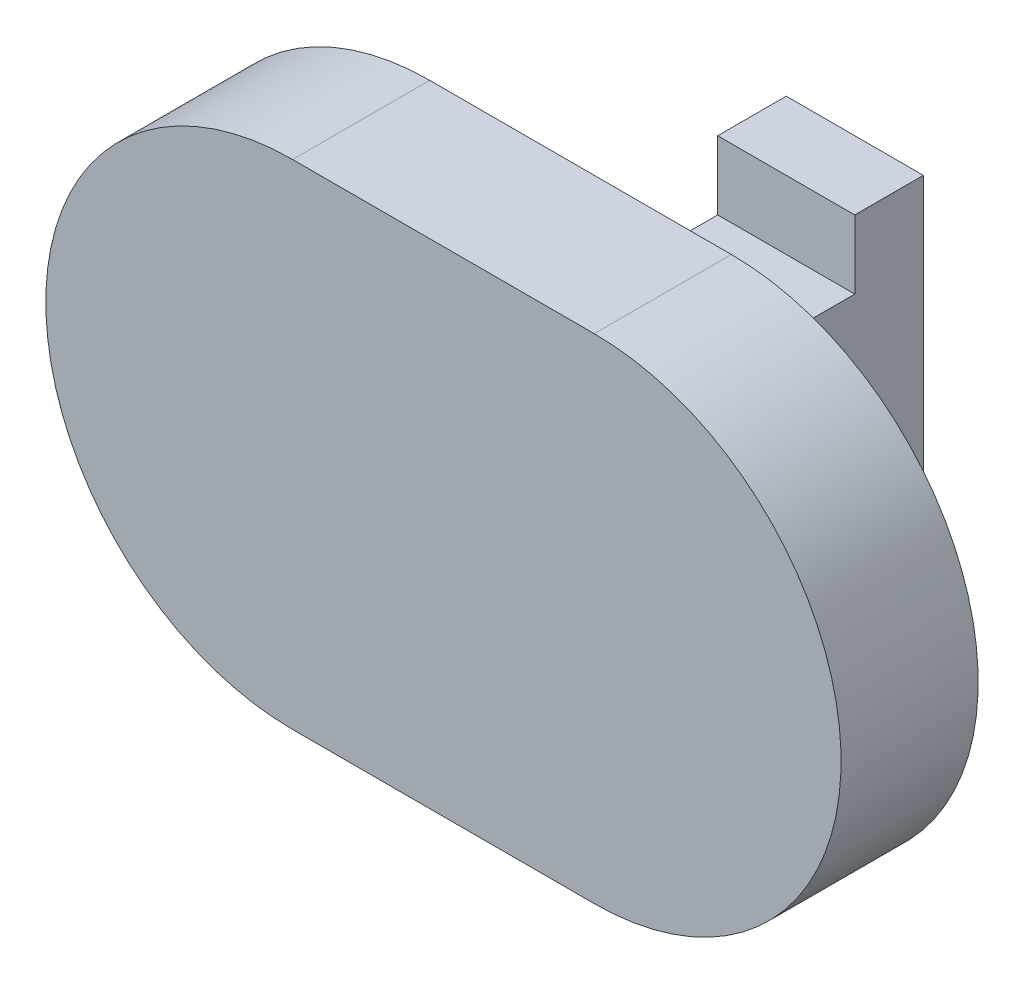
ISO-10303-21;
HEADER;
FILE_DESCRIPTION(('STEP AP214'),'2;1');
FILE_NAME('part.step','',(''),(''),'','','');
FILE_SCHEMA(('AUTOMOTIVE_DESIGN { 1 0 10303 214 1 1 1 1 }'));
ENDSEC;
DATA;
#1=APPLICATION_CONTEXT('core data for automotive mechanical design processes');
#2=APPLICATION_PROTOCOL_DEFINITION('international standard','automotive_design',2000,#1);
#3=PRODUCT_CONTEXT('',#1,'mechanical');
#4=PRODUCT('Part','Part','',(#3));
#5=PRODUCT_RELATED_PRODUCT_CATEGORY('part','',(#4));
#6=PRODUCT_DEFINITION_FORMATION('','',#4);
#7=PRODUCT_DEFINITION_CONTEXT('part definition',#1,'design');
#8=PRODUCT_DEFINITION('design','',#6,#7);
#9=PRODUCT_DEFINITION_SHAPE('','',#8);
#10=(LENGTH_UNIT() NAMED_UNIT(*) SI_UNIT(.MILLI.,.METRE.));
#11=(NAMED_UNIT(*) PLANE_ANGLE_UNIT() SI_UNIT($,.RADIAN.));
#12=(NAMED_UNIT(*) SI_UNIT($,.STERADIAN.) SOLID_ANGLE_UNIT());
#13=UNCERTAINTY_MEASURE_WITH_UNIT(LENGTH_MEASURE(1.E-05),#10,'distance_accuracy_value','');
#14=(GEOMETRIC_REPRESENTATION_CONTEXT(3) GLOBAL_UNCERTAINTY_ASSIGNED_CONTEXT((#13)) GLOBAL_UNIT_ASSIGNED_CONTEXT((#10,
#11,#12)) REPRESENTATION_CONTEXT('',''));
#15=CARTESIAN_POINT('',(0.,0.,0.));
#16=DIRECTION('',(0.,0.,1.));
#17=DIRECTION('',(1.,0.,0.));
#18=AXIS2_PLACEMENT_3D('',#15,#16,#17);
#19=CARTESIAN_POINT('',(-1.397,0.,-1.27));
#20=DIRECTION('',(0.,0.,1.));
#21=DIRECTION('',(1.,0.,0.));
#22=AXIS2_PLACEMENT_3D('',#19,#20,#21);
#23=PLANE('',#22);
#24=CARTESIAN_POINT('',(-1.397,0.,-1.27));
#25=DIRECTION('',(0.,0.,1.));
#26=DIRECTION('',(1.,0.,0.));
#27=AXIS2_PLACEMENT_3D('',#24,#25,#26);
#28=CIRCLE('',#27,2.286);
#29=CARTESIAN_POINT('',(-1.397,2.286,-1.27));
#30=VERTEX_POINT('',#29);
#31=CARTESIAN_POINT('',(-1.397,-2.286,-1.27));
#32=VERTEX_POINT('',#31);
#33=EDGE_CURVE('E189',#30,#32,#28,.T.);
#34=ORIENTED_EDGE('',*,*,#33,.F.);
#35=DIRECTION('',(-1.,0.,0.));
#36=VECTOR('',#35,1.);
#37=CARTESIAN_POINT('',(-1.397,2.286,-1.27));
#38=LINE('',#37,#36);
#39=CARTESIAN_POINT('',(1.397,2.286,-1.27));
#40=VERTEX_POINT('',#39);
#41=EDGE_CURVE('E199',#40,#30,#38,.T.);
#42=ORIENTED_EDGE('',*,*,#41,.F.);
#43=CARTESIAN_POINT('',(1.397,0.,-1.27));
#44=DIRECTION('',(0.,0.,1.));
#45=DIRECTION('',(1.,0.,0.));
#46=AXIS2_PLACEMENT_3D('',#43,#44,#45);
#47=CIRCLE('',#46,2.286);
#48=CARTESIAN_POINT('',(1.397,-2.286,-1.27));
#49=VERTEX_POINT('',#48);
#50=EDGE_CURVE('E196',#49,#40,#47,.T.);
#51=ORIENTED_EDGE('',*,*,#50,.F.);
#52=DIRECTION('',(1.,0.,0.));
#53=VECTOR('',#52,1.);
#54=CARTESIAN_POINT('',(-1.397,-2.286,-1.27));
#55=LINE('',#54,#53);
#56=EDGE_CURVE('E192',#32,#49,#55,.T.);
#57=ORIENTED_EDGE('',*,*,#56,.F.);
#58=EDGE_LOOP('',(#34,#42,#51,#57));
#59=FACE_BOUND('',#58,.T.);
#60=DIRECTION('',(0.,-1.,0.));
#61=VECTOR('',#60,1.);
#62=CARTESIAN_POINT('',(0.635,0.635,-1.27));
#63=LINE('',#62,#61);
#64=CARTESIAN_POINT('',(0.635,0.635,-1.27));
#65=VERTEX_POINT('',#64);
#66=CARTESIAN_POINT('',(0.635,-0.635,-1.27));
#67=VERTEX_POINT('',#66);
#68=EDGE_CURVE('E61',#65,#67,#63,.T.);
#69=ORIENTED_EDGE('',*,*,#68,.F.);
#70=DIRECTION('',(1.,0.,0.));
#71=VECTOR('',#70,1.);
#72=CARTESIAN_POINT('',(-0.635,0.635,-1.27));
#73=LINE('',#72,#71);
#74=CARTESIAN_POINT('',(-0.635,0.635,-1.27));
#75=VERTEX_POINT('',#74);
#76=EDGE_CURVE('E65',#75,#65,#73,.T.);
#77=ORIENTED_EDGE('',*,*,#76,.F.);
#78=DIRECTION('',(0.,1.,0.));
#79=VECTOR('',#78,1.);
#80=CARTESIAN_POINT('',(-0.635,0.635,-1.27));
#81=LINE('',#80,#79);
#82=CARTESIAN_POINT('',(-0.635,-0.635,-1.27));
#83=VERTEX_POINT('',#82);
#84=EDGE_CURVE('E174',#83,#75,#81,.T.);
#85=ORIENTED_EDGE('',*,*,#84,.F.);
#86=DIRECTION('',(-1.,0.,0.));
#87=VECTOR('',#86,1.);
#88=CARTESIAN_POINT('',(-0.635,-0.635,-1.27));
#89=LINE('',#88,#87);
#90=EDGE_CURVE('E159',#67,#83,#89,.T.);
#91=ORIENTED_EDGE('',*,*,#90,.F.);
#92=EDGE_LOOP('',(#69,#77,#85,#91));
#93=FACE_BOUND('',#92,.T.);
#94=ADVANCED_FACE('F44',(#59,#93),#23,.F.);
#95=CARTESIAN_POINT('',(-1.397,0.,-1.27));
#96=DIRECTION('',(0.,0.,1.));
#97=DIRECTION('',(1.,0.,0.));
#98=AXIS2_PLACEMENT_3D('',#95,#96,#97);
#99=CYLINDRICAL_SURFACE('',#98,2.286);
#100=CARTESIAN_POINT('',(-1.397,0.,0.));
#101=DIRECTION('',(0.,0.,1.));
#102=DIRECTION('',(1.,0.,0.));
#103=AXIS2_PLACEMENT_3D('',#100,#101,#102);
#104=CIRCLE('',#103,2.286);
#105=CARTESIAN_POINT('',(-1.397,2.286,0.));
#106=VERTEX_POINT('',#105);
#107=CARTESIAN_POINT('',(-1.397,-2.286,0.));
#108=VERTEX_POINT('',#107);
#109=EDGE_CURVE('E188',#106,#108,#104,.T.);
#110=ORIENTED_EDGE('',*,*,#109,.F.);
#111=DIRECTION('',(0.,0.,1.));
#112=VECTOR('',#111,1.);
#113=CARTESIAN_POINT('',(-1.397,2.286,-1.27));
#114=LINE('',#113,#112);
#115=EDGE_CURVE('E13',#30,#106,#114,.T.);
#116=ORIENTED_EDGE('',*,*,#115,.F.);
#117=ORIENTED_EDGE('',*,*,#33,.T.);
#118=DIRECTION('',(0.,0.,1.));
#119=VECTOR('',#118,1.);
#120=CARTESIAN_POINT('',(-1.397,-2.286,-1.27));
#121=LINE('',#120,#119);
#122=EDGE_CURVE('E48',#32,#108,#121,.T.);
#123=ORIENTED_EDGE('',*,*,#122,.T.);
#124=EDGE_LOOP('',(#110,#116,#117,#123));
#125=FACE_BOUND('',#124,.T.);
#126=ADVANCED_FACE('F46',(#125),#99,.T.);
#127=CARTESIAN_POINT('',(-1.397,2.286,-1.27));
#128=DIRECTION('',(0.,1.,0.));
#129=DIRECTION('',(-1.,0.,0.));
#130=AXIS2_PLACEMENT_3D('',#127,#128,#129);
#131=PLANE('',#130);
#132=DIRECTION('',(-1.,0.,0.));
#133=VECTOR('',#132,1.);
#134=CARTESIAN_POINT('',(-1.397,2.286,0.));
#135=LINE('',#134,#133);
#136=CARTESIAN_POINT('',(1.397,2.286,0.));
#137=VERTEX_POINT('',#136);
#138=EDGE_CURVE('E193',#137,#106,#135,.T.);
#139=ORIENTED_EDGE('',*,*,#138,.F.);
#140=DIRECTION('',(0.,0.,1.));
#141=VECTOR('',#140,1.);
#142=CARTESIAN_POINT('',(1.397,2.286,-1.27));
#143=LINE('',#142,#141);
#144=EDGE_CURVE('E53',#40,#137,#143,.T.);
#145=ORIENTED_EDGE('',*,*,#144,.F.);
#146=ORIENTED_EDGE('',*,*,#41,.T.);
#147=ORIENTED_EDGE('',*,*,#115,.T.);
#148=EDGE_LOOP('',(#139,#145,#146,#147));
#149=FACE_BOUND('',#148,.T.);
#150=ADVANCED_FACE('F225',(#149),#131,.T.);
#151=CARTESIAN_POINT('',(1.397,0.,-1.27));
#152=DIRECTION('',(0.,0.,1.));
#153=DIRECTION('',(1.,0.,0.));
#154=AXIS2_PLACEMENT_3D('',#151,#152,#153);
#155=CYLINDRICAL_SURFACE('',#154,2.286);
#156=CARTESIAN_POINT('',(1.397,0.,0.));
#157=DIRECTION('',(0.,0.,1.));
#158=DIRECTION('',(1.,0.,0.));
#159=AXIS2_PLACEMENT_3D('',#156,#157,#158);
#160=CIRCLE('',#159,2.286);
#161=CARTESIAN_POINT('',(1.397,-2.286,0.));
#162=VERTEX_POINT('',#161);
#163=EDGE_CURVE('E207',#162,#137,#160,.T.);
#164=ORIENTED_EDGE('',*,*,#163,.F.);
#165=DIRECTION('',(0.,0.,1.));
#166=VECTOR('',#165,1.);
#167=CARTESIAN_POINT('',(1.397,-2.286,-1.27));
#168=LINE('',#167,#166);
#169=EDGE_CURVE('E212',#49,#162,#168,.T.);
#170=ORIENTED_EDGE('',*,*,#169,.F.);
#171=ORIENTED_EDGE('',*,*,#50,.T.);
#172=ORIENTED_EDGE('',*,*,#144,.T.);
#173=EDGE_LOOP('',(#164,#170,#171,#172));
#174=FACE_BOUND('',#173,.T.);
#175=ADVANCED_FACE('F230',(#174),#155,.T.);
#176=CARTESIAN_POINT('',(-1.397,-2.286,-1.27));
#177=DIRECTION('',(0.,-1.,0.));
#178=DIRECTION('',(1.,0.,0.));
#179=AXIS2_PLACEMENT_3D('',#176,#177,#178);
#180=PLANE('',#179);
#181=DIRECTION('',(1.,0.,0.));
#182=VECTOR('',#181,1.);
#183=CARTESIAN_POINT('',(-1.397,-2.286,0.));
#184=LINE('',#183,#182);
#185=EDGE_CURVE('E204',#108,#162,#184,.T.);
#186=ORIENTED_EDGE('',*,*,#185,.F.);
#187=ORIENTED_EDGE('',*,*,#122,.F.);
#188=ORIENTED_EDGE('',*,*,#56,.T.);
#189=ORIENTED_EDGE('',*,*,#169,.T.);
#190=EDGE_LOOP('',(#186,#187,#188,#189));
#191=FACE_BOUND('',#190,.T.);
#192=ADVANCED_FACE('F220',(#191),#180,.T.);
#193=CARTESIAN_POINT('',(-1.397,0.,0.));
#194=DIRECTION('',(0.,0.,1.));
#195=DIRECTION('',(1.,0.,0.));
#196=AXIS2_PLACEMENT_3D('',#193,#194,#195);
#197=PLANE('',#196);
#198=ORIENTED_EDGE('',*,*,#109,.T.);
#199=ORIENTED_EDGE('',*,*,#185,.T.);
#200=ORIENTED_EDGE('',*,*,#163,.T.);
#201=ORIENTED_EDGE('',*,*,#138,.T.);
#202=EDGE_LOOP('',(#198,#199,#200,#201));
#203=FACE_BOUND('',#202,.T.);
#204=ADVANCED_FACE('F222',(#203),#197,.T.);
#205=CARTESIAN_POINT('',(0.635,0.635,-3.175));
#206=DIRECTION('',(-1.,0.,0.));
#207=DIRECTION('',(0.,-1.,0.));
#208=AXIS2_PLACEMENT_3D('',#205,#206,#207);
#209=PLANE('',#208);
#210=ORIENTED_EDGE('',*,*,#68,.T.);
#211=DIRECTION('',(0.,0.,1.));
#212=VECTOR('',#211,1.);
#213=CARTESIAN_POINT('',(0.635,-0.635,-3.175));
#214=LINE('',#213,#212);
#215=CARTESIAN_POINT('',(0.635,-0.635,-3.175));
#216=VERTEX_POINT('',#215);
#217=EDGE_CURVE('E185',#216,#67,#214,.T.);
#218=ORIENTED_EDGE('',*,*,#217,.F.);
#219=DIRECTION('',(0.,-1.,0.));
#220=VECTOR('',#219,1.);
#221=CARTESIAN_POINT('',(0.635,-1.27,-3.175));
#222=LINE('',#221,#220);
#223=CARTESIAN_POINT('',(0.635,-1.27,-3.175));
#224=VERTEX_POINT('',#223);
#225=EDGE_CURVE('E156',#216,#224,#222,.T.);
#226=ORIENTED_EDGE('',*,*,#225,.T.);
#227=DIRECTION('',(0.,0.,1.));
#228=VECTOR('',#227,1.);
#229=CARTESIAN_POINT('',(0.635,-1.27,-3.81));
#230=LINE('',#229,#228);
#231=CARTESIAN_POINT('',(0.635,-1.27,-3.81));
#232=VERTEX_POINT('',#231);
#233=EDGE_CURVE('E136',#232,#224,#230,.T.);
#234=ORIENTED_EDGE('',*,*,#233,.F.);
#235=DIRECTION('',(0.,-1.,0.));
#236=VECTOR('',#235,1.);
#237=CARTESIAN_POINT('',(0.635,-1.27,-3.81));
#238=LINE('',#237,#236);
#239=CARTESIAN_POINT('',(0.635,1.27,-3.81));
#240=VERTEX_POINT('',#239);
#241=EDGE_CURVE('E142',#240,#232,#238,.T.);
#242=ORIENTED_EDGE('',*,*,#241,.F.);
#243=DIRECTION('',(0.,0.,1.));
#244=VECTOR('',#243,1.);
#245=CARTESIAN_POINT('',(0.635,1.27,-3.81));
#246=LINE('',#245,#244);
#247=CARTESIAN_POINT('',(0.635,1.27,-3.175));
#248=VERTEX_POINT('',#247);
#249=EDGE_CURVE('E383',#240,#248,#246,.T.);
#250=ORIENTED_EDGE('',*,*,#249,.T.);
#251=CARTESIAN_POINT('',(0.635,0.635,-3.175));
#252=VERTEX_POINT('',#251);
#253=EDGE_CURVE('E378',#248,#252,#222,.T.);
#254=ORIENTED_EDGE('',*,*,#253,.T.);
#255=DIRECTION('',(0.,0.,1.));
#256=VECTOR('',#255,1.);
#257=CARTESIAN_POINT('',(0.635,0.635,-3.175));
#258=LINE('',#257,#256);
#259=EDGE_CURVE('E170',#252,#65,#258,.T.);
#260=ORIENTED_EDGE('',*,*,#259,.T.);
#261=EDGE_LOOP('',(#210,#218,#226,#234,#242,#250,#254,#260));
#262=FACE_BOUND('',#261,.T.);
#263=ADVANCED_FACE('F153',(#262),#209,.F.);
#264=CARTESIAN_POINT('',(-0.635,-0.635,-3.175));
#265=DIRECTION('',(0.,1.,0.));
#266=DIRECTION('',(-1.,0.,0.));
#267=AXIS2_PLACEMENT_3D('',#264,#265,#266);
#268=PLANE('',#267);
#269=ORIENTED_EDGE('',*,*,#90,.T.);
#270=DIRECTION('',(0.,0.,1.));
#271=VECTOR('',#270,1.);
#272=CARTESIAN_POINT('',(-0.635,-0.635,-3.175));
#273=LINE('',#272,#271);
#274=CARTESIAN_POINT('',(-0.635,-0.635,-3.175));
#275=VERTEX_POINT('',#274);
#276=EDGE_CURVE('E182',#275,#83,#273,.T.);
#277=ORIENTED_EDGE('',*,*,#276,.F.);
#278=DIRECTION('',(-1.,0.,0.));
#279=VECTOR('',#278,1.);
#280=CARTESIAN_POINT('',(-0.635,-0.635,-3.175));
#281=LINE('',#280,#279);
#282=EDGE_CURVE('E165',#216,#275,#281,.T.);
#283=ORIENTED_EDGE('',*,*,#282,.F.);
#284=ORIENTED_EDGE('',*,*,#217,.T.);
#285=EDGE_LOOP('',(#269,#277,#283,#284));
#286=FACE_BOUND('',#285,.T.);
#287=ADVANCED_FACE('F250',(#286),#268,.F.);
#288=CARTESIAN_POINT('',(-0.635,0.635,-3.175));
#289=DIRECTION('',(1.,0.,0.));
#290=DIRECTION('',(0.,1.,0.));
#291=AXIS2_PLACEMENT_3D('',#288,#289,#290);
#292=PLANE('',#291);
#293=ORIENTED_EDGE('',*,*,#84,.T.);
#294=DIRECTION('',(0.,0.,1.));
#295=VECTOR('',#294,1.);
#296=CARTESIAN_POINT('',(-0.635,0.635,-3.175));
#297=LINE('',#296,#295);
#298=CARTESIAN_POINT('',(-0.635,0.635,-3.175));
#299=VERTEX_POINT('',#298);
#300=EDGE_CURVE('E179',#299,#75,#297,.T.);
#301=ORIENTED_EDGE('',*,*,#300,.F.);
#302=DIRECTION('',(0.,1.,0.));
#303=VECTOR('',#302,1.);
#304=CARTESIAN_POINT('',(-0.635,-1.27,-3.175));
#305=LINE('',#304,#303);
#306=CARTESIAN_POINT('',(-0.635,1.27,-3.175));
#307=VERTEX_POINT('',#306);
#308=EDGE_CURVE('E368',#299,#307,#305,.T.);
#309=ORIENTED_EDGE('',*,*,#308,.T.);
#310=DIRECTION('',(0.,0.,1.));
#311=VECTOR('',#310,1.);
#312=CARTESIAN_POINT('',(-0.635,1.27,-3.81));
#313=LINE('',#312,#311);
#314=CARTESIAN_POINT('',(-0.635,1.27,-3.81));
#315=VERTEX_POINT('',#314);
#316=EDGE_CURVE('E161',#315,#307,#313,.T.);
#317=ORIENTED_EDGE('',*,*,#316,.F.);
#318=DIRECTION('',(0.,1.,0.));
#319=VECTOR('',#318,1.);
#320=CARTESIAN_POINT('',(-0.635,-1.27,-3.81));
#321=LINE('',#320,#319);
#322=CARTESIAN_POINT('',(-0.635,-1.27,-3.81));
#323=VERTEX_POINT('',#322);
#324=EDGE_CURVE('E141',#323,#315,#321,.T.);
#325=ORIENTED_EDGE('',*,*,#324,.F.);
#326=DIRECTION('',(0.,0.,1.));
#327=VECTOR('',#326,1.);
#328=CARTESIAN_POINT('',(-0.635,-1.27,-3.81));
#329=LINE('',#328,#327);
#330=CARTESIAN_POINT('',(-0.635,-1.27,-3.175));
#331=VERTEX_POINT('',#330);
#332=EDGE_CURVE('E138',#323,#331,#329,.T.);
#333=ORIENTED_EDGE('',*,*,#332,.T.);
#334=EDGE_CURVE('E374',#331,#275,#305,.T.);
#335=ORIENTED_EDGE('',*,*,#334,.T.);
#336=ORIENTED_EDGE('',*,*,#276,.T.);
#337=EDGE_LOOP('',(#293,#301,#309,#317,#325,#333,#335,#336));
#338=FACE_BOUND('',#337,.T.);
#339=ADVANCED_FACE('F254',(#338),#292,.F.);
#340=CARTESIAN_POINT('',(-0.635,0.635,-3.175));
#341=DIRECTION('',(0.,-1.,0.));
#342=DIRECTION('',(1.,0.,0.));
#343=AXIS2_PLACEMENT_3D('',#340,#341,#342);
#344=PLANE('',#343);
#345=ORIENTED_EDGE('',*,*,#76,.T.);
#346=ORIENTED_EDGE('',*,*,#259,.F.);
#347=DIRECTION('',(1.,0.,0.));
#348=VECTOR('',#347,1.);
#349=CARTESIAN_POINT('',(-0.635,0.635,-3.175));
#350=LINE('',#349,#348);
#351=EDGE_CURVE('E168',#299,#252,#350,.T.);
#352=ORIENTED_EDGE('',*,*,#351,.F.);
#353=ORIENTED_EDGE('',*,*,#300,.T.);
#354=EDGE_LOOP('',(#345,#346,#352,#353));
#355=FACE_BOUND('',#354,.T.);
#356=ADVANCED_FACE('F259',(#355),#344,.F.);
#357=CARTESIAN_POINT('',(0.,0.,-3.175));
#358=DIRECTION('',(0.,0.,-1.));
#359=DIRECTION('',(-1.,0.,0.));
#360=AXIS2_PLACEMENT_3D('',#357,#358,#359);
#361=PLANE('',#360);
#362=ORIENTED_EDGE('',*,*,#225,.F.);
#363=ORIENTED_EDGE('',*,*,#282,.T.);
#364=ORIENTED_EDGE('',*,*,#334,.F.);
#365=DIRECTION('',(-1.,0.,0.));
#366=VECTOR('',#365,1.);
#367=CARTESIAN_POINT('',(-0.635,-1.27,-3.175));
#368=LINE('',#367,#366);
#369=EDGE_CURVE('E375',#224,#331,#368,.T.);
#370=ORIENTED_EDGE('',*,*,#369,.F.);
#371=EDGE_LOOP('',(#362,#363,#364,#370));
#372=FACE_BOUND('',#371,.T.);
#373=ADVANCED_FACE('F265',(#372),#361,.F.);
#374=ORIENTED_EDGE('',*,*,#308,.F.);
#375=ORIENTED_EDGE('',*,*,#351,.T.);
#376=ORIENTED_EDGE('',*,*,#253,.F.);
#377=DIRECTION('',(1.,0.,0.));
#378=VECTOR('',#377,1.);
#379=CARTESIAN_POINT('',(-0.635,1.27,-3.175));
#380=LINE('',#379,#378);
#381=EDGE_CURVE('E151',#307,#248,#380,.T.);
#382=ORIENTED_EDGE('',*,*,#381,.F.);
#383=EDGE_LOOP('',(#374,#375,#376,#382));
#384=FACE_BOUND('',#383,.T.);
#385=ADVANCED_FACE('F270',(#384),#361,.F.);
#386=CARTESIAN_POINT('',(-0.635,-1.27,-3.81));
#387=DIRECTION('',(0.,1.,0.));
#388=DIRECTION('',(0.,0.,1.));
#389=AXIS2_PLACEMENT_3D('',#386,#387,#388);
#390=PLANE('',#389);
#391=ORIENTED_EDGE('',*,*,#369,.T.);
#392=ORIENTED_EDGE('',*,*,#332,.F.);
#393=DIRECTION('',(-1.,0.,0.));
#394=VECTOR('',#393,1.);
#395=CARTESIAN_POINT('',(-0.635,-1.27,-3.81));
#396=LINE('',#395,#394);
#397=EDGE_CURVE('E132',#232,#323,#396,.T.);
#398=ORIENTED_EDGE('',*,*,#397,.F.);
#399=ORIENTED_EDGE('',*,*,#233,.T.);
#400=EDGE_LOOP('',(#391,#392,#398,#399));
#401=FACE_BOUND('',#400,.T.);
#402=ADVANCED_FACE('F134',(#401),#390,.F.);
#403=CARTESIAN_POINT('',(-0.635,1.27,-3.81));
#404=DIRECTION('',(0.,-1.,0.));
#405=DIRECTION('',(0.,0.,-1.));
#406=AXIS2_PLACEMENT_3D('',#403,#404,#405);
#407=PLANE('',#406);
#408=ORIENTED_EDGE('',*,*,#381,.T.);
#409=ORIENTED_EDGE('',*,*,#249,.F.);
#410=DIRECTION('',(1.,0.,0.));
#411=VECTOR('',#410,1.);
#412=CARTESIAN_POINT('',(-0.635,1.27,-3.81));
#413=LINE('',#412,#411);
#414=EDGE_CURVE('E147',#315,#240,#413,.T.);
#415=ORIENTED_EDGE('',*,*,#414,.F.);
#416=ORIENTED_EDGE('',*,*,#316,.T.);
#417=EDGE_LOOP('',(#408,#409,#415,#416));
#418=FACE_BOUND('',#417,.T.);
#419=ADVANCED_FACE('F269',(#418),#407,.F.);
#420=CARTESIAN_POINT('',(0.,0.,-3.81));
#421=DIRECTION('',(0.,0.,-1.));
#422=DIRECTION('',(-1.,0.,0.));
#423=AXIS2_PLACEMENT_3D('',#420,#421,#422);
#424=PLANE('',#423);
#425=ORIENTED_EDGE('',*,*,#241,.T.);
#426=ORIENTED_EDGE('',*,*,#397,.T.);
#427=ORIENTED_EDGE('',*,*,#324,.T.);
#428=ORIENTED_EDGE('',*,*,#414,.T.);
#429=EDGE_LOOP('',(#425,#426,#427,#428));
#430=FACE_BOUND('',#429,.T.);
#431=ADVANCED_FACE('F145',(#430),#424,.T.);
#432=CLOSED_SHELL('',(#94,#126,#150,#175,#192,#204,#263,#287,#339,#356,#373,#385,#402,#419,#431));
#433=MANIFOLD_SOLID_BREP('B2',#432);
#434=ADVANCED_BREP_SHAPE_REPRESENTATION('',(#18,#433),#14);
#435=SHAPE_DEFINITION_REPRESENTATION(#9,#434);
ENDSEC;
END-ISO-10303-21;
